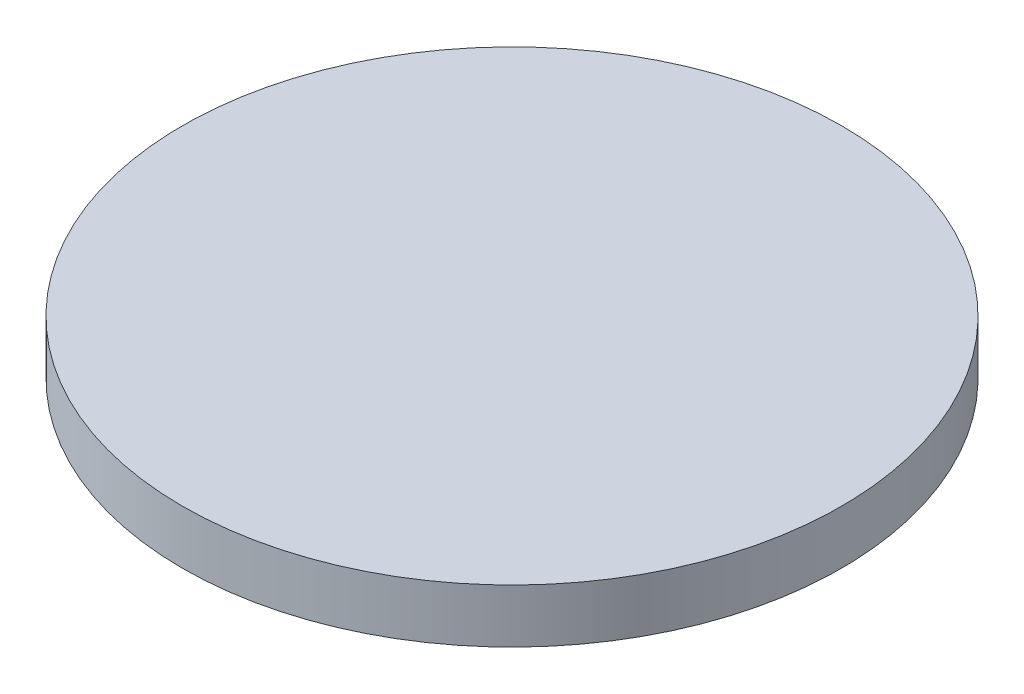
ISO-10303-21;
HEADER;
FILE_DESCRIPTION(('STEP AP214'),'2;1');
FILE_NAME('part.step','',(''),(''),'','','');
FILE_SCHEMA(('AUTOMOTIVE_DESIGN { 1 0 10303 214 1 1 1 1 }'));
ENDSEC;
DATA;
#1=APPLICATION_CONTEXT('core data for automotive mechanical design processes');
#2=APPLICATION_PROTOCOL_DEFINITION('international standard','automotive_design',2000,#1);
#3=PRODUCT_CONTEXT('',#1,'mechanical');
#4=PRODUCT('Part','Part','',(#3));
#5=PRODUCT_RELATED_PRODUCT_CATEGORY('part','',(#4));
#6=PRODUCT_DEFINITION_FORMATION('','',#4);
#7=PRODUCT_DEFINITION_CONTEXT('part definition',#1,'design');
#8=PRODUCT_DEFINITION('design','',#6,#7);
#9=PRODUCT_DEFINITION_SHAPE('','',#8);
#10=(LENGTH_UNIT() NAMED_UNIT(*) SI_UNIT(.MILLI.,.METRE.));
#11=(NAMED_UNIT(*) PLANE_ANGLE_UNIT() SI_UNIT($,.RADIAN.));
#12=(NAMED_UNIT(*) SI_UNIT($,.STERADIAN.) SOLID_ANGLE_UNIT());
#13=UNCERTAINTY_MEASURE_WITH_UNIT(LENGTH_MEASURE(1.E-05),#10,'distance_accuracy_value','');
#14=(GEOMETRIC_REPRESENTATION_CONTEXT(3) GLOBAL_UNCERTAINTY_ASSIGNED_CONTEXT((#13)) GLOBAL_UNIT_ASSIGNED_CONTEXT((#10,
#11,#12)) REPRESENTATION_CONTEXT('',''));
#15=CARTESIAN_POINT('',(0.,0.,0.));
#16=DIRECTION('',(0.,0.,1.));
#17=DIRECTION('',(1.,0.,0.));
#18=AXIS2_PLACEMENT_3D('',#15,#16,#17);
#19=CARTESIAN_POINT('',(0.,16.51,0.));
#20=DIRECTION('',(0.,-1.,0.));
#21=DIRECTION('',(0.,0.,-1.));
#22=AXIS2_PLACEMENT_3D('',#19,#20,#21);
#23=CYLINDRICAL_SURFACE('',#22,101.2);
#24=CARTESIAN_POINT('',(0.,16.51,0.));
#25=DIRECTION('',(0.,1.,0.));
#26=DIRECTION('',(0.,0.,1.));
#27=AXIS2_PLACEMENT_3D('',#24,#25,#26);
#28=CIRCLE('',#27,101.2);
#29=CARTESIAN_POINT('',(0.,16.51,101.2));
#30=VERTEX_POINT('',#29);
#31=EDGE_CURVE('E10',#30,#30,#28,.T.);
#32=ORIENTED_EDGE('',*,*,#31,.F.);
#33=EDGE_LOOP('',(#32));
#34=FACE_BOUND('',#33,.T.);
#35=CARTESIAN_POINT('',(0.,0.,0.));
#36=DIRECTION('',(0.,1.,0.));
#37=DIRECTION('',(0.,0.,1.));
#38=AXIS2_PLACEMENT_3D('',#35,#36,#37);
#39=CIRCLE('',#38,101.2);
#40=CARTESIAN_POINT('',(0.,0.,101.2));
#41=VERTEX_POINT('',#40);
#42=EDGE_CURVE('E40',#41,#41,#39,.T.);
#43=ORIENTED_EDGE('',*,*,#42,.T.);
#44=EDGE_LOOP('',(#43));
#45=FACE_BOUND('',#44,.T.);
#46=ADVANCED_FACE('F37',(#34,#45),#23,.T.);
#47=CARTESIAN_POINT('',(0.,16.51,0.));
#48=DIRECTION('',(0.,1.,0.));
#49=DIRECTION('',(0.,0.,1.));
#50=AXIS2_PLACEMENT_3D('',#47,#48,#49);
#51=PLANE('',#50);
#52=ORIENTED_EDGE('',*,*,#31,.T.);
#53=EDGE_LOOP('',(#52));
#54=FACE_BOUND('',#53,.T.);
#55=ADVANCED_FACE('F54',(#54),#51,.T.);
#56=CARTESIAN_POINT('',(0.,0.,0.));
#57=DIRECTION('',(0.,1.,0.));
#58=DIRECTION('',(0.,0.,1.));
#59=AXIS2_PLACEMENT_3D('',#56,#57,#58);
#60=PLANE('',#59);
#61=ORIENTED_EDGE('',*,*,#42,.F.);
#62=EDGE_LOOP('',(#61));
#63=FACE_BOUND('',#62,.T.);
#64=ADVANCED_FACE('F52',(#63),#60,.F.);
#65=CLOSED_SHELL('',(#46,#55,#64));
#66=MANIFOLD_SOLID_BREP('B2',#65);
#67=ADVANCED_BREP_SHAPE_REPRESENTATION('',(#18,#66),#14);
#68=SHAPE_DEFINITION_REPRESENTATION(#9,#67);
ENDSEC;
END-ISO-10303-21;
